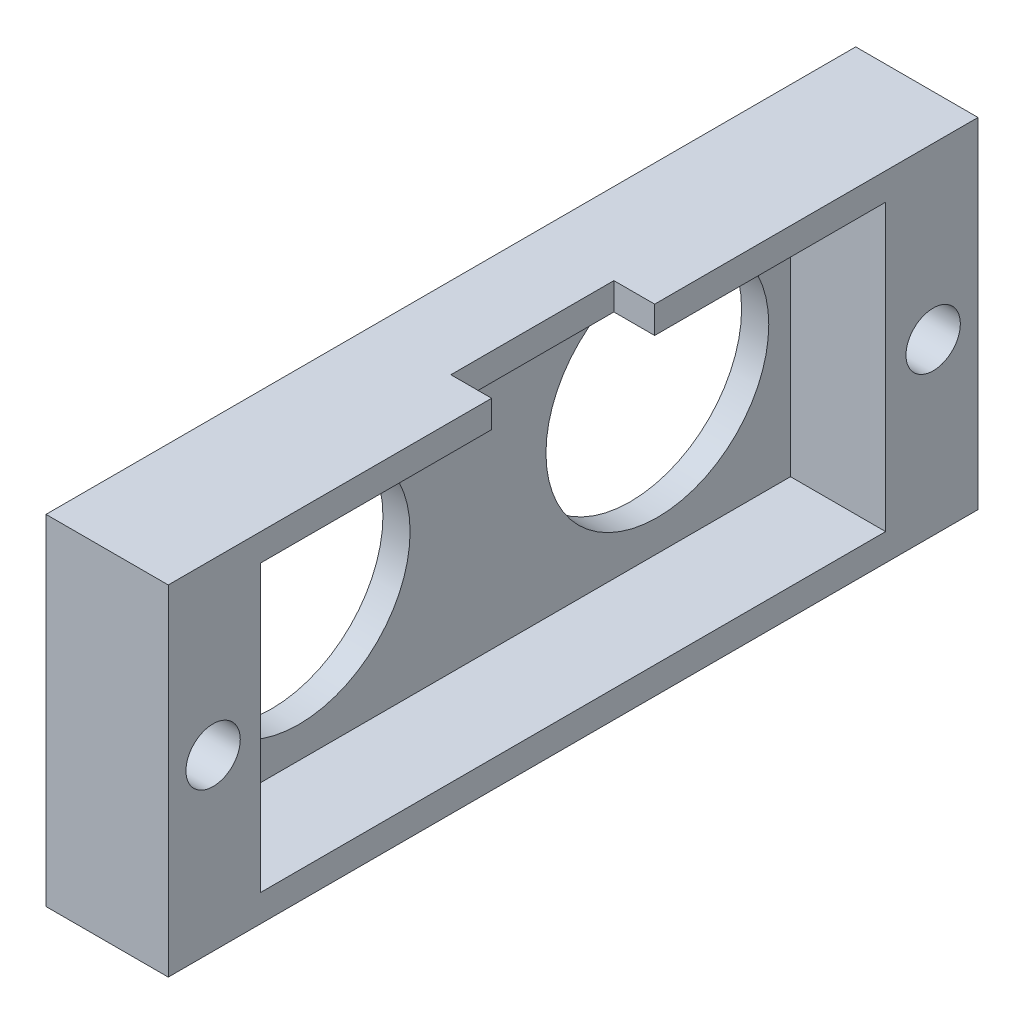
ISO-10303-21;
HEADER;
FILE_DESCRIPTION(('STEP AP214'),'2;1');
FILE_NAME('part.step','',(''),(''),'','','');
FILE_SCHEMA(('AUTOMOTIVE_DESIGN { 1 0 10303 214 1 1 1 1 }'));
ENDSEC;
DATA;
#1=APPLICATION_CONTEXT('core data for automotive mechanical design processes');
#2=APPLICATION_PROTOCOL_DEFINITION('international standard','automotive_design',2000,#1);
#3=PRODUCT_CONTEXT('',#1,'mechanical');
#4=PRODUCT('Part','Part','',(#3));
#5=PRODUCT_RELATED_PRODUCT_CATEGORY('part','',(#4));
#6=PRODUCT_DEFINITION_FORMATION('','',#4);
#7=PRODUCT_DEFINITION_CONTEXT('part definition',#1,'design');
#8=PRODUCT_DEFINITION('design','',#6,#7);
#9=PRODUCT_DEFINITION_SHAPE('','',#8);
#10=(LENGTH_UNIT() NAMED_UNIT(*) SI_UNIT(.MILLI.,.METRE.));
#11=(NAMED_UNIT(*) PLANE_ANGLE_UNIT() SI_UNIT($,.RADIAN.));
#12=(NAMED_UNIT(*) SI_UNIT($,.STERADIAN.) SOLID_ANGLE_UNIT());
#13=UNCERTAINTY_MEASURE_WITH_UNIT(LENGTH_MEASURE(1.E-05),#10,'distance_accuracy_value','');
#14=(GEOMETRIC_REPRESENTATION_CONTEXT(3) GLOBAL_UNCERTAINTY_ASSIGNED_CONTEXT((#13)) GLOBAL_UNIT_ASSIGNED_CONTEXT((#10,
#11,#12)) REPRESENTATION_CONTEXT('',''));
#15=CARTESIAN_POINT('',(0.,0.,0.));
#16=DIRECTION('',(0.,0.,1.));
#17=DIRECTION('',(1.,0.,0.));
#18=AXIS2_PLACEMENT_3D('',#15,#16,#17);
#19=CARTESIAN_POINT('',(2.,12.5,0.));
#20=DIRECTION('',(0.,-1.,0.));
#21=DIRECTION('',(0.,0.,-1.));
#22=AXIS2_PLACEMENT_3D('',#19,#20,#21);
#23=PLANE('',#22);
#24=DIRECTION('',(-1.,0.,0.));
#25=VECTOR('',#24,1.);
#26=CARTESIAN_POINT('',(6.,12.5000000000001,5.99999999999998));
#27=LINE('',#26,#25);
#28=CARTESIAN_POINT('',(9.,12.5000000000001,5.99999999999998));
#29=VERTEX_POINT('',#28);
#30=CARTESIAN_POINT('',(6.,12.5,5.99999999999998));
#31=VERTEX_POINT('',#30);
#32=EDGE_CURVE('E133',#29,#31,#27,.T.);
#33=ORIENTED_EDGE('',*,*,#32,.T.);
#34=DIRECTION('',(0.,0.,-1.));
#35=VECTOR('',#34,1.);
#36=CARTESIAN_POINT('',(6.,12.5,-6.00000000000002));
#37=LINE('',#36,#35);
#38=CARTESIAN_POINT('',(6.,12.5,-6.00000000000002));
#39=VERTEX_POINT('',#38);
#40=EDGE_CURVE('E124',#31,#39,#37,.T.);
#41=ORIENTED_EDGE('',*,*,#40,.T.);
#42=DIRECTION('',(1.,0.,0.));
#43=VECTOR('',#42,1.);
#44=CARTESIAN_POINT('',(9.,12.5,-6.00000000000002));
#45=LINE('',#44,#43);
#46=CARTESIAN_POINT('',(9.,12.5,-6.00000000000002));
#47=VERTEX_POINT('',#46);
#48=EDGE_CURVE('E132',#39,#47,#45,.T.);
#49=ORIENTED_EDGE('',*,*,#48,.T.);
#50=DIRECTION('',(0.,0.,1.));
#51=VECTOR('',#50,1.);
#52=CARTESIAN_POINT('',(9.,12.5,-29.8));
#53=LINE('',#52,#51);
#54=CARTESIAN_POINT('',(9.,12.5,-29.8));
#55=VERTEX_POINT('',#54);
#56=EDGE_CURVE('E193',#55,#47,#53,.T.);
#57=ORIENTED_EDGE('',*,*,#56,.F.);
#58=DIRECTION('',(-1.,0.,0.));
#59=VECTOR('',#58,1.);
#60=CARTESIAN_POINT('',(2.,12.5,-29.8));
#61=LINE('',#60,#59);
#62=CARTESIAN_POINT('',(0.,12.5,-29.8));
#63=VERTEX_POINT('',#62);
#64=EDGE_CURVE('E235',#55,#63,#61,.T.);
#65=ORIENTED_EDGE('',*,*,#64,.T.);
#66=DIRECTION('',(0.,0.,1.));
#67=VECTOR('',#66,1.);
#68=CARTESIAN_POINT('',(0.,12.5,0.));
#69=LINE('',#68,#67);
#70=CARTESIAN_POINT('',(0.,12.5,29.8));
#71=VERTEX_POINT('',#70);
#72=EDGE_CURVE('E222',#63,#71,#69,.T.);
#73=ORIENTED_EDGE('',*,*,#72,.T.);
#74=DIRECTION('',(-1.,0.,0.));
#75=VECTOR('',#74,1.);
#76=CARTESIAN_POINT('',(2.,12.5,29.8));
#77=LINE('',#76,#75);
#78=CARTESIAN_POINT('',(9.,12.5,29.8));
#79=VERTEX_POINT('',#78);
#80=EDGE_CURVE('E232',#79,#71,#77,.T.);
#81=ORIENTED_EDGE('',*,*,#80,.F.);
#82=EDGE_CURVE('E143',#29,#79,#53,.T.);
#83=ORIENTED_EDGE('',*,*,#82,.F.);
#84=EDGE_LOOP('',(#33,#41,#49,#57,#65,#73,#81,#83));
#85=FACE_BOUND('',#84,.T.);
#86=ADVANCED_FACE('F35',(#85),#23,.F.);
#87=CARTESIAN_POINT('',(9.,0.,0.));
#88=DIRECTION('',(1.,0.,0.));
#89=DIRECTION('',(0.,0.,-1.));
#90=AXIS2_PLACEMENT_3D('',#87,#88,#89);
#91=PLANE('',#90);
#92=CARTESIAN_POINT('',(9.,0.,26.5));
#93=DIRECTION('',(1.,0.,0.));
#94=DIRECTION('',(0.,0.,-1.));
#95=AXIS2_PLACEMENT_3D('',#92,#93,#94);
#96=CIRCLE('',#95,2.);
#97=CARTESIAN_POINT('',(9.,0.,24.5));
#98=VERTEX_POINT('',#97);
#99=EDGE_CURVE('E154',#98,#98,#96,.T.);
#100=ORIENTED_EDGE('',*,*,#99,.F.);
#101=EDGE_LOOP('',(#100));
#102=FACE_BOUND('',#101,.T.);
#103=CARTESIAN_POINT('',(9.,0.,-26.5));
#104=DIRECTION('',(1.,0.,0.));
#105=DIRECTION('',(0.,0.,-1.));
#106=AXIS2_PLACEMENT_3D('',#103,#104,#105);
#107=CIRCLE('',#106,2.);
#108=CARTESIAN_POINT('',(9.,0.,-28.5));
#109=VERTEX_POINT('',#108);
#110=EDGE_CURVE('E138',#109,#109,#107,.T.);
#111=ORIENTED_EDGE('',*,*,#110,.F.);
#112=EDGE_LOOP('',(#111));
#113=FACE_BOUND('',#112,.T.);
#114=DIRECTION('',(0.,0.,1.));
#115=VECTOR('',#114,1.);
#116=CARTESIAN_POINT('',(9.,10.5,23.));
#117=LINE('',#116,#115);
#118=CARTESIAN_POINT('',(9.,10.5,5.99999999999998));
#119=VERTEX_POINT('',#118);
#120=CARTESIAN_POINT('',(9.,10.5,23.));
#121=VERTEX_POINT('',#120);
#122=EDGE_CURVE('E165',#119,#121,#117,.T.);
#123=ORIENTED_EDGE('',*,*,#122,.F.);
#124=DIRECTION('',(0.,-1.,0.));
#125=VECTOR('',#124,1.);
#126=CARTESIAN_POINT('',(9.,94.0682229792951,5.99999999999987));
#127=LINE('',#126,#125);
#128=EDGE_CURVE('E139',#29,#119,#127,.T.);
#129=ORIENTED_EDGE('',*,*,#128,.F.);
#130=ORIENTED_EDGE('',*,*,#82,.T.);
#131=DIRECTION('',(0.,-1.,0.));
#132=VECTOR('',#131,1.);
#133=CARTESIAN_POINT('',(9.,12.5,29.8));
#134=LINE('',#133,#132);
#135=CARTESIAN_POINT('',(9.,-12.5,29.8));
#136=VERTEX_POINT('',#135);
#137=EDGE_CURVE('E196',#79,#136,#134,.T.);
#138=ORIENTED_EDGE('',*,*,#137,.T.);
#139=DIRECTION('',(0.,0.,-1.));
#140=VECTOR('',#139,1.);
#141=CARTESIAN_POINT('',(9.,-12.5,29.8));
#142=LINE('',#141,#140);
#143=CARTESIAN_POINT('',(9.,-12.5,-29.8));
#144=VERTEX_POINT('',#143);
#145=EDGE_CURVE('E187',#136,#144,#142,.T.);
#146=ORIENTED_EDGE('',*,*,#145,.T.);
#147=DIRECTION('',(0.,1.,0.));
#148=VECTOR('',#147,1.);
#149=CARTESIAN_POINT('',(9.,-12.5,-29.8));
#150=LINE('',#149,#148);
#151=EDGE_CURVE('E190',#144,#55,#150,.T.);
#152=ORIENTED_EDGE('',*,*,#151,.T.);
#153=ORIENTED_EDGE('',*,*,#56,.T.);
#154=DIRECTION('',(0.,-1.,0.));
#155=VECTOR('',#154,1.);
#156=CARTESIAN_POINT('',(9.,94.0682229792951,-6.00000000000013));
#157=LINE('',#156,#155);
#158=CARTESIAN_POINT('',(9.,10.5,-6.00000000000002));
#159=VERTEX_POINT('',#158);
#160=EDGE_CURVE('E147',#47,#159,#157,.T.);
#161=ORIENTED_EDGE('',*,*,#160,.T.);
#162=CARTESIAN_POINT('',(9.,10.5,-23.));
#163=VERTEX_POINT('',#162);
#164=EDGE_CURVE('E166',#163,#159,#117,.T.);
#165=ORIENTED_EDGE('',*,*,#164,.F.);
#166=DIRECTION('',(0.,1.,0.));
#167=VECTOR('',#166,1.);
#168=CARTESIAN_POINT('',(9.,10.5,-23.));
#169=LINE('',#168,#167);
#170=CARTESIAN_POINT('',(9.,-10.5,-23.));
#171=VERTEX_POINT('',#170);
#172=EDGE_CURVE('E162',#171,#163,#169,.T.);
#173=ORIENTED_EDGE('',*,*,#172,.F.);
#174=DIRECTION('',(0.,0.,-1.));
#175=VECTOR('',#174,1.);
#176=CARTESIAN_POINT('',(9.,-10.5,23.));
#177=LINE('',#176,#175);
#178=CARTESIAN_POINT('',(9.,-10.5,23.));
#179=VERTEX_POINT('',#178);
#180=EDGE_CURVE('E159',#179,#171,#177,.T.);
#181=ORIENTED_EDGE('',*,*,#180,.F.);
#182=DIRECTION('',(0.,-1.,0.));
#183=VECTOR('',#182,1.);
#184=CARTESIAN_POINT('',(9.,10.5,23.));
#185=LINE('',#184,#183);
#186=EDGE_CURVE('E157',#121,#179,#185,.T.);
#187=ORIENTED_EDGE('',*,*,#186,.F.);
#188=EDGE_LOOP('',(#123,#129,#130,#138,#146,#152,#153,#161,#165,#173,#181,#187));
#189=FACE_BOUND('',#188,.T.);
#190=ADVANCED_FACE('F246',(#102,#113,#189),#91,.T.);
#191=CARTESIAN_POINT('',(9.,10.5,23.));
#192=DIRECTION('',(0.,-1.,0.));
#193=DIRECTION('',(0.,0.,-1.));
#194=AXIS2_PLACEMENT_3D('',#191,#192,#193);
#195=PLANE('',#194);
#196=DIRECTION('',(0.,0.,1.));
#197=VECTOR('',#196,1.);
#198=CARTESIAN_POINT('',(6.,10.5,23.));
#199=LINE('',#198,#197);
#200=CARTESIAN_POINT('',(6.,10.5,-6.00000000000002));
#201=VERTEX_POINT('',#200);
#202=CARTESIAN_POINT('',(6.,10.5,5.99999999999998));
#203=VERTEX_POINT('',#202);
#204=EDGE_CURVE('E43',#201,#203,#199,.T.);
#205=ORIENTED_EDGE('',*,*,#204,.T.);
#206=DIRECTION('',(1.,0.,0.));
#207=VECTOR('',#206,1.);
#208=CARTESIAN_POINT('',(9.,10.5,5.99999999999998));
#209=LINE('',#208,#207);
#210=EDGE_CURVE('E11',#203,#119,#209,.T.);
#211=ORIENTED_EDGE('',*,*,#210,.T.);
#212=ORIENTED_EDGE('',*,*,#122,.T.);
#213=DIRECTION('',(-1.,0.,0.));
#214=VECTOR('',#213,1.);
#215=CARTESIAN_POINT('',(9.,10.5,23.));
#216=LINE('',#215,#214);
#217=CARTESIAN_POINT('',(2.,10.5,23.));
#218=VERTEX_POINT('',#217);
#219=EDGE_CURVE('E169',#121,#218,#216,.T.);
#220=ORIENTED_EDGE('',*,*,#219,.T.);
#221=DIRECTION('',(0.,0.,1.));
#222=VECTOR('',#221,1.);
#223=CARTESIAN_POINT('',(2.,10.5,23.));
#224=LINE('',#223,#222);
#225=CARTESIAN_POINT('',(2.,10.5,-23.));
#226=VERTEX_POINT('',#225);
#227=EDGE_CURVE('E160',#226,#218,#224,.T.);
#228=ORIENTED_EDGE('',*,*,#227,.F.);
#229=DIRECTION('',(-1.,0.,0.));
#230=VECTOR('',#229,1.);
#231=CARTESIAN_POINT('',(9.,10.5,-23.));
#232=LINE('',#231,#230);
#233=EDGE_CURVE('E178',#163,#226,#232,.T.);
#234=ORIENTED_EDGE('',*,*,#233,.F.);
#235=ORIENTED_EDGE('',*,*,#164,.T.);
#236=DIRECTION('',(-1.,0.,0.));
#237=VECTOR('',#236,1.);
#238=CARTESIAN_POINT('',(9.00000000000002,10.5,-6.00000000000002));
#239=LINE('',#238,#237);
#240=EDGE_CURVE('E238',#159,#201,#239,.T.);
#241=ORIENTED_EDGE('',*,*,#240,.T.);
#242=EDGE_LOOP('',(#205,#211,#212,#220,#228,#234,#235,#241));
#243=FACE_BOUND('',#242,.T.);
#244=ADVANCED_FACE('F241',(#243),#195,.T.);
#245=CARTESIAN_POINT('',(2.,0.,-29.8));
#246=DIRECTION('',(0.,0.,1.));
#247=DIRECTION('',(1.,0.,0.));
#248=AXIS2_PLACEMENT_3D('',#245,#246,#247);
#249=PLANE('',#248);
#250=DIRECTION('',(0.,1.,0.));
#251=VECTOR('',#250,1.);
#252=CARTESIAN_POINT('',(0.,0.,-29.8));
#253=LINE('',#252,#251);
#254=CARTESIAN_POINT('',(0.,-12.5,-29.8));
#255=VERTEX_POINT('',#254);
#256=EDGE_CURVE('E219',#255,#63,#253,.T.);
#257=ORIENTED_EDGE('',*,*,#256,.T.);
#258=ORIENTED_EDGE('',*,*,#64,.F.);
#259=ORIENTED_EDGE('',*,*,#151,.F.);
#260=DIRECTION('',(-1.,0.,0.));
#261=VECTOR('',#260,1.);
#262=CARTESIAN_POINT('',(2.,-12.5,-29.8));
#263=LINE('',#262,#261);
#264=EDGE_CURVE('E207',#144,#255,#263,.T.);
#265=ORIENTED_EDGE('',*,*,#264,.T.);
#266=EDGE_LOOP('',(#257,#258,#259,#265));
#267=FACE_BOUND('',#266,.T.);
#268=ADVANCED_FACE('F252',(#267),#249,.F.);
#269=CARTESIAN_POINT('',(2.,0.,29.8));
#270=DIRECTION('',(0.,0.,-1.));
#271=DIRECTION('',(-1.,0.,0.));
#272=AXIS2_PLACEMENT_3D('',#269,#270,#271);
#273=PLANE('',#272);
#274=DIRECTION('',(0.,-1.,0.));
#275=VECTOR('',#274,1.);
#276=CARTESIAN_POINT('',(0.,0.,29.8));
#277=LINE('',#276,#275);
#278=CARTESIAN_POINT('',(0.,-12.5,29.8));
#279=VERTEX_POINT('',#278);
#280=EDGE_CURVE('E224',#71,#279,#277,.T.);
#281=ORIENTED_EDGE('',*,*,#280,.T.);
#282=DIRECTION('',(-1.,0.,0.));
#283=VECTOR('',#282,1.);
#284=CARTESIAN_POINT('',(2.,-12.5,29.8));
#285=LINE('',#284,#283);
#286=EDGE_CURVE('E229',#136,#279,#285,.T.);
#287=ORIENTED_EDGE('',*,*,#286,.F.);
#288=ORIENTED_EDGE('',*,*,#137,.F.);
#289=ORIENTED_EDGE('',*,*,#80,.T.);
#290=EDGE_LOOP('',(#281,#287,#288,#289));
#291=FACE_BOUND('',#290,.T.);
#292=ADVANCED_FACE('F258',(#291),#273,.F.);
#293=CARTESIAN_POINT('',(2.,0.,-13.2));
#294=DIRECTION('',(-1.,0.,0.));
#295=DIRECTION('',(0.,0.,1.));
#296=AXIS2_PLACEMENT_3D('',#293,#294,#295);
#297=CYLINDRICAL_SURFACE('',#296,8.2);
#298=CARTESIAN_POINT('',(2.,0.,-13.2));
#299=DIRECTION('',(1.,0.,0.));
#300=DIRECTION('',(0.,0.,-1.));
#301=AXIS2_PLACEMENT_3D('',#298,#299,#300);
#302=CIRCLE('',#301,8.2);
#303=CARTESIAN_POINT('',(2.,0.,-21.4));
#304=VERTEX_POINT('',#303);
#305=EDGE_CURVE('E203',#304,#304,#302,.T.);
#306=ORIENTED_EDGE('',*,*,#305,.T.);
#307=EDGE_LOOP('',(#306));
#308=FACE_BOUND('',#307,.T.);
#309=CARTESIAN_POINT('',(0.,0.,-13.2));
#310=DIRECTION('',(1.,0.,0.));
#311=DIRECTION('',(0.,0.,-1.));
#312=AXIS2_PLACEMENT_3D('',#309,#310,#311);
#313=CIRCLE('',#312,8.2);
#314=CARTESIAN_POINT('',(0.,0.,-21.4));
#315=VERTEX_POINT('',#314);
#316=EDGE_CURVE('E216',#315,#315,#313,.T.);
#317=ORIENTED_EDGE('',*,*,#316,.F.);
#318=EDGE_LOOP('',(#317));
#319=FACE_BOUND('',#318,.T.);
#320=ADVANCED_FACE('F284',(#308,#319),#297,.F.);
#321=CARTESIAN_POINT('',(2.,0.,13.2));
#322=DIRECTION('',(-1.,0.,0.));
#323=DIRECTION('',(0.,0.,1.));
#324=AXIS2_PLACEMENT_3D('',#321,#322,#323);
#325=CYLINDRICAL_SURFACE('',#324,8.2);
#326=CARTESIAN_POINT('',(2.,0.,13.2));
#327=DIRECTION('',(1.,0.,0.));
#328=DIRECTION('',(0.,0.,-1.));
#329=AXIS2_PLACEMENT_3D('',#326,#327,#328);
#330=CIRCLE('',#329,8.2);
#331=CARTESIAN_POINT('',(2.,0.,5.));
#332=VERTEX_POINT('',#331);
#333=EDGE_CURVE('E200',#332,#332,#330,.T.);
#334=ORIENTED_EDGE('',*,*,#333,.T.);
#335=EDGE_LOOP('',(#334));
#336=FACE_BOUND('',#335,.T.);
#337=CARTESIAN_POINT('',(0.,0.,13.2));
#338=DIRECTION('',(1.,0.,0.));
#339=DIRECTION('',(0.,0.,-1.));
#340=AXIS2_PLACEMENT_3D('',#337,#338,#339);
#341=CIRCLE('',#340,8.2);
#342=CARTESIAN_POINT('',(0.,0.,5.));
#343=VERTEX_POINT('',#342);
#344=EDGE_CURVE('E213',#343,#343,#341,.T.);
#345=ORIENTED_EDGE('',*,*,#344,.F.);
#346=EDGE_LOOP('',(#345));
#347=FACE_BOUND('',#346,.T.);
#348=ADVANCED_FACE('F287',(#336,#347),#325,.F.);
#349=CARTESIAN_POINT('',(2.,0.,26.5));
#350=DIRECTION('',(-1.,0.,0.));
#351=DIRECTION('',(0.,0.,1.));
#352=AXIS2_PLACEMENT_3D('',#349,#350,#351);
#353=CYLINDRICAL_SURFACE('',#352,2.);
#354=CARTESIAN_POINT('',(0.,0.,26.5));
#355=DIRECTION('',(1.,0.,0.));
#356=DIRECTION('',(0.,0.,-1.));
#357=AXIS2_PLACEMENT_3D('',#354,#355,#356);
#358=CIRCLE('',#357,2.);
#359=CARTESIAN_POINT('',(0.,0.,24.5));
#360=VERTEX_POINT('',#359);
#361=EDGE_CURVE('E210',#360,#360,#358,.T.);
#362=ORIENTED_EDGE('',*,*,#361,.F.);
#363=EDGE_LOOP('',(#362));
#364=FACE_BOUND('',#363,.T.);
#365=ORIENTED_EDGE('',*,*,#99,.T.);
#366=EDGE_LOOP('',(#365));
#367=FACE_BOUND('',#366,.T.);
#368=ADVANCED_FACE('F312',(#364,#367),#353,.F.);
#369=CARTESIAN_POINT('',(2.,0.,-26.5));
#370=DIRECTION('',(-1.,0.,0.));
#371=DIRECTION('',(0.,0.,1.));
#372=AXIS2_PLACEMENT_3D('',#369,#370,#371);
#373=CYLINDRICAL_SURFACE('',#372,2.);
#374=CARTESIAN_POINT('',(0.,0.,-26.5));
#375=DIRECTION('',(1.,0.,0.));
#376=DIRECTION('',(0.,0.,-1.));
#377=AXIS2_PLACEMENT_3D('',#374,#375,#376);
#378=CIRCLE('',#377,2.);
#379=CARTESIAN_POINT('',(0.,0.,-28.5));
#380=VERTEX_POINT('',#379);
#381=EDGE_CURVE('E199',#380,#380,#378,.T.);
#382=ORIENTED_EDGE('',*,*,#381,.F.);
#383=EDGE_LOOP('',(#382));
#384=FACE_BOUND('',#383,.T.);
#385=ORIENTED_EDGE('',*,*,#110,.T.);
#386=EDGE_LOOP('',(#385));
#387=FACE_BOUND('',#386,.T.);
#388=ADVANCED_FACE('F37',(#384,#387),#373,.F.);
#389=CARTESIAN_POINT('',(2.,-12.5,0.));
#390=DIRECTION('',(0.,1.,0.));
#391=DIRECTION('',(0.,0.,1.));
#392=AXIS2_PLACEMENT_3D('',#389,#390,#391);
#393=PLANE('',#392);
#394=DIRECTION('',(0.,0.,-1.));
#395=VECTOR('',#394,1.);
#396=CARTESIAN_POINT('',(0.,-12.5,0.));
#397=LINE('',#396,#395);
#398=EDGE_CURVE('E204',#279,#255,#397,.T.);
#399=ORIENTED_EDGE('',*,*,#398,.T.);
#400=ORIENTED_EDGE('',*,*,#264,.F.);
#401=ORIENTED_EDGE('',*,*,#145,.F.);
#402=ORIENTED_EDGE('',*,*,#286,.T.);
#403=EDGE_LOOP('',(#399,#400,#401,#402));
#404=FACE_BOUND('',#403,.T.);
#405=ADVANCED_FACE('F262',(#404),#393,.F.);
#406=CARTESIAN_POINT('',(2.,0.,0.));
#407=DIRECTION('',(1.,0.,0.));
#408=DIRECTION('',(0.,0.,-1.));
#409=AXIS2_PLACEMENT_3D('',#406,#407,#408);
#410=PLANE('',#409);
#411=DIRECTION('',(0.,-1.,0.));
#412=VECTOR('',#411,1.);
#413=CARTESIAN_POINT('',(2.,10.5,23.));
#414=LINE('',#413,#412);
#415=CARTESIAN_POINT('',(2.,-10.5,23.));
#416=VERTEX_POINT('',#415);
#417=EDGE_CURVE('E58',#218,#416,#414,.T.);
#418=ORIENTED_EDGE('',*,*,#417,.T.);
#419=DIRECTION('',(0.,0.,-1.));
#420=VECTOR('',#419,1.);
#421=CARTESIAN_POINT('',(2.,-10.5,23.));
#422=LINE('',#421,#420);
#423=CARTESIAN_POINT('',(2.,-10.5,-23.));
#424=VERTEX_POINT('',#423);
#425=EDGE_CURVE('E171',#416,#424,#422,.T.);
#426=ORIENTED_EDGE('',*,*,#425,.T.);
#427=DIRECTION('',(0.,1.,0.));
#428=VECTOR('',#427,1.);
#429=CARTESIAN_POINT('',(2.,10.5,-23.));
#430=LINE('',#429,#428);
#431=EDGE_CURVE('E173',#424,#226,#430,.T.);
#432=ORIENTED_EDGE('',*,*,#431,.T.);
#433=ORIENTED_EDGE('',*,*,#227,.T.);
#434=EDGE_LOOP('',(#418,#426,#432,#433));
#435=FACE_BOUND('',#434,.T.);
#436=ORIENTED_EDGE('',*,*,#333,.F.);
#437=EDGE_LOOP('',(#436));
#438=FACE_BOUND('',#437,.T.);
#439=ORIENTED_EDGE('',*,*,#305,.F.);
#440=EDGE_LOOP('',(#439));
#441=FACE_BOUND('',#440,.T.);
#442=ADVANCED_FACE('F276',(#435,#438,#441),#410,.T.);
#443=CARTESIAN_POINT('',(0.,0.,0.));
#444=DIRECTION('',(1.,0.,0.));
#445=DIRECTION('',(0.,0.,-1.));
#446=AXIS2_PLACEMENT_3D('',#443,#444,#445);
#447=PLANE('',#446);
#448=ORIENTED_EDGE('',*,*,#381,.T.);
#449=EDGE_LOOP('',(#448));
#450=FACE_BOUND('',#449,.T.);
#451=ORIENTED_EDGE('',*,*,#361,.T.);
#452=EDGE_LOOP('',(#451));
#453=FACE_BOUND('',#452,.T.);
#454=ORIENTED_EDGE('',*,*,#344,.T.);
#455=EDGE_LOOP('',(#454));
#456=FACE_BOUND('',#455,.T.);
#457=ORIENTED_EDGE('',*,*,#316,.T.);
#458=EDGE_LOOP('',(#457));
#459=FACE_BOUND('',#458,.T.);
#460=ORIENTED_EDGE('',*,*,#256,.F.);
#461=ORIENTED_EDGE('',*,*,#398,.F.);
#462=ORIENTED_EDGE('',*,*,#280,.F.);
#463=ORIENTED_EDGE('',*,*,#72,.F.);
#464=EDGE_LOOP('',(#460,#461,#462,#463));
#465=FACE_BOUND('',#464,.T.);
#466=ADVANCED_FACE('F255',(#450,#453,#456,#459,#465),#447,.F.);
#467=CARTESIAN_POINT('',(9.,10.5,23.));
#468=DIRECTION('',(0.,0.,-1.));
#469=DIRECTION('',(-1.,0.,0.));
#470=AXIS2_PLACEMENT_3D('',#467,#468,#469);
#471=PLANE('',#470);
#472=ORIENTED_EDGE('',*,*,#417,.F.);
#473=ORIENTED_EDGE('',*,*,#219,.F.);
#474=ORIENTED_EDGE('',*,*,#186,.T.);
#475=DIRECTION('',(-1.,0.,0.));
#476=VECTOR('',#475,1.);
#477=CARTESIAN_POINT('',(9.,-10.5,23.));
#478=LINE('',#477,#476);
#479=EDGE_CURVE('E184',#179,#416,#478,.T.);
#480=ORIENTED_EDGE('',*,*,#479,.T.);
#481=EDGE_LOOP('',(#472,#473,#474,#480));
#482=FACE_BOUND('',#481,.T.);
#483=ADVANCED_FACE('F268',(#482),#471,.T.);
#484=CARTESIAN_POINT('',(9.,-10.5,23.));
#485=DIRECTION('',(0.,1.,0.));
#486=DIRECTION('',(0.,0.,1.));
#487=AXIS2_PLACEMENT_3D('',#484,#485,#486);
#488=PLANE('',#487);
#489=ORIENTED_EDGE('',*,*,#425,.F.);
#490=ORIENTED_EDGE('',*,*,#479,.F.);
#491=ORIENTED_EDGE('',*,*,#180,.T.);
#492=DIRECTION('',(-1.,0.,0.));
#493=VECTOR('',#492,1.);
#494=CARTESIAN_POINT('',(9.,-10.5,-23.));
#495=LINE('',#494,#493);
#496=EDGE_CURVE('E181',#171,#424,#495,.T.);
#497=ORIENTED_EDGE('',*,*,#496,.T.);
#498=EDGE_LOOP('',(#489,#490,#491,#497));
#499=FACE_BOUND('',#498,.T.);
#500=ADVANCED_FACE('F271',(#499),#488,.T.);
#501=CARTESIAN_POINT('',(9.,10.5,-23.));
#502=DIRECTION('',(0.,0.,1.));
#503=DIRECTION('',(0.,-1.,0.));
#504=AXIS2_PLACEMENT_3D('',#501,#502,#503);
#505=PLANE('',#504);
#506=ORIENTED_EDGE('',*,*,#431,.F.);
#507=ORIENTED_EDGE('',*,*,#496,.F.);
#508=ORIENTED_EDGE('',*,*,#172,.T.);
#509=ORIENTED_EDGE('',*,*,#233,.T.);
#510=EDGE_LOOP('',(#506,#507,#508,#509));
#511=FACE_BOUND('',#510,.T.);
#512=ADVANCED_FACE('F275',(#511),#505,.T.);
#513=CARTESIAN_POINT('',(6.,94.0682229792951,5.99999999999987));
#514=DIRECTION('',(0.,0.,-1.));
#515=DIRECTION('',(0.,1.,0.));
#516=AXIS2_PLACEMENT_3D('',#513,#514,#515);
#517=PLANE('',#516);
#518=ORIENTED_EDGE('',*,*,#210,.F.);
#519=DIRECTION('',(0.,-1.,0.));
#520=VECTOR('',#519,1.);
#521=CARTESIAN_POINT('',(6.,94.0682229792951,5.99999999999987));
#522=LINE('',#521,#520);
#523=EDGE_CURVE('E127',#31,#203,#522,.T.);
#524=ORIENTED_EDGE('',*,*,#523,.F.);
#525=ORIENTED_EDGE('',*,*,#32,.F.);
#526=ORIENTED_EDGE('',*,*,#128,.T.);
#527=EDGE_LOOP('',(#518,#524,#525,#526));
#528=FACE_BOUND('',#527,.T.);
#529=ADVANCED_FACE('F136',(#528),#517,.T.);
#530=CARTESIAN_POINT('',(6.,94.0682229792951,-6.00000000000013));
#531=DIRECTION('',(1.,0.,0.));
#532=DIRECTION('',(0.,0.,-1.));
#533=AXIS2_PLACEMENT_3D('',#530,#531,#532);
#534=PLANE('',#533);
#535=ORIENTED_EDGE('',*,*,#204,.F.);
#536=DIRECTION('',(0.,-1.,0.));
#537=VECTOR('',#536,1.);
#538=CARTESIAN_POINT('',(6.,94.0682229792951,-6.00000000000013));
#539=LINE('',#538,#537);
#540=EDGE_CURVE('E50',#39,#201,#539,.T.);
#541=ORIENTED_EDGE('',*,*,#540,.F.);
#542=ORIENTED_EDGE('',*,*,#40,.F.);
#543=ORIENTED_EDGE('',*,*,#523,.T.);
#544=EDGE_LOOP('',(#535,#541,#542,#543));
#545=FACE_BOUND('',#544,.T.);
#546=ADVANCED_FACE('F126',(#545),#534,.T.);
#547=CARTESIAN_POINT('',(9.,94.0682229792951,-6.00000000000013));
#548=DIRECTION('',(0.,0.,1.));
#549=DIRECTION('',(0.,-1.,0.));
#550=AXIS2_PLACEMENT_3D('',#547,#548,#549);
#551=PLANE('',#550);
#552=ORIENTED_EDGE('',*,*,#240,.F.);
#553=ORIENTED_EDGE('',*,*,#160,.F.);
#554=ORIENTED_EDGE('',*,*,#48,.F.);
#555=ORIENTED_EDGE('',*,*,#540,.T.);
#556=EDGE_LOOP('',(#552,#553,#554,#555));
#557=FACE_BOUND('',#556,.T.);
#558=ADVANCED_FACE('F244',(#557),#551,.T.);
#559=CLOSED_SHELL('',(#86,#190,#244,#268,#292,#320,#348,#368,#388,#405,#442,#466,#483,#500,#512,
#529,#546,#558));
#560=MANIFOLD_SOLID_BREP('B2',#559);
#561=ADVANCED_BREP_SHAPE_REPRESENTATION('',(#18,#560),#14);
#562=SHAPE_DEFINITION_REPRESENTATION(#9,#561);
ENDSEC;
END-ISO-10303-21;
